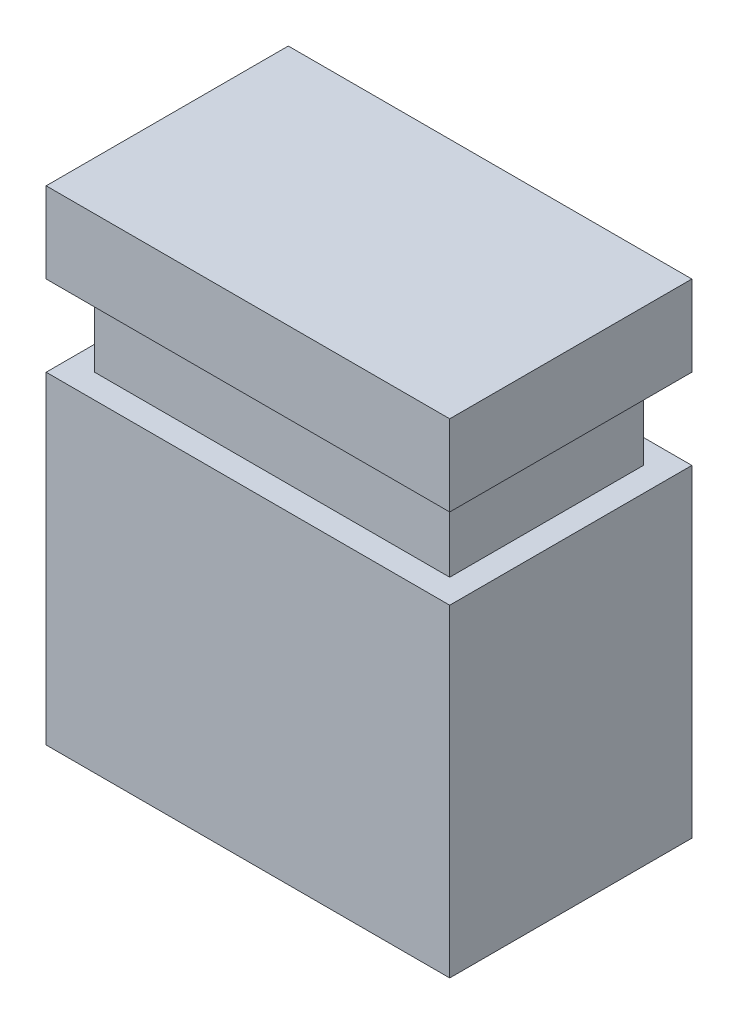
ISO-10303-21;
HEADER;
FILE_DESCRIPTION(('STEP AP214'),'2;1');
FILE_NAME('part.step','',(''),(''),'','','');
FILE_SCHEMA(('AUTOMOTIVE_DESIGN { 1 0 10303 214 1 1 1 1 }'));
ENDSEC;
DATA;
#1=APPLICATION_CONTEXT('core data for automotive mechanical design processes');
#2=APPLICATION_PROTOCOL_DEFINITION('international standard','automotive_design',2000,#1);
#3=PRODUCT_CONTEXT('',#1,'mechanical');
#4=PRODUCT('Part','Part','',(#3));
#5=PRODUCT_RELATED_PRODUCT_CATEGORY('part','',(#4));
#6=PRODUCT_DEFINITION_FORMATION('','',#4);
#7=PRODUCT_DEFINITION_CONTEXT('part definition',#1,'design');
#8=PRODUCT_DEFINITION('design','',#6,#7);
#9=PRODUCT_DEFINITION_SHAPE('','',#8);
#10=(LENGTH_UNIT() NAMED_UNIT(*) SI_UNIT(.MILLI.,.METRE.));
#11=(NAMED_UNIT(*) PLANE_ANGLE_UNIT() SI_UNIT($,.RADIAN.));
#12=(NAMED_UNIT(*) SI_UNIT($,.STERADIAN.) SOLID_ANGLE_UNIT());
#13=UNCERTAINTY_MEASURE_WITH_UNIT(LENGTH_MEASURE(1.E-05),#10,'distance_accuracy_value','');
#14=(GEOMETRIC_REPRESENTATION_CONTEXT(3) GLOBAL_UNCERTAINTY_ASSIGNED_CONTEXT((#13)) GLOBAL_UNIT_ASSIGNED_CONTEXT((#10,
#11,#12)) REPRESENTATION_CONTEXT('',''));
#15=CARTESIAN_POINT('',(0.,0.,0.));
#16=DIRECTION('',(0.,0.,1.));
#17=DIRECTION('',(1.,0.,0.));
#18=AXIS2_PLACEMENT_3D('',#15,#16,#17);
#19=CARTESIAN_POINT('',(0.,2.,0.));
#20=DIRECTION('',(0.,1.,0.));
#21=DIRECTION('',(0.,0.,1.));
#22=AXIS2_PLACEMENT_3D('',#19,#20,#21);
#23=PLANE('',#22);
#24=DIRECTION('',(0.,0.,-1.));
#25=VECTOR('',#24,1.);
#26=CARTESIAN_POINT('',(1.25,2.,-0.75));
#27=LINE('',#26,#25);
#28=CARTESIAN_POINT('',(1.25,2.,0.75));
#29=VERTEX_POINT('',#28);
#30=CARTESIAN_POINT('',(1.25,2.,-0.75));
#31=VERTEX_POINT('',#30);
#32=EDGE_CURVE('E362',#29,#31,#27,.T.);
#33=ORIENTED_EDGE('',*,*,#32,.T.);
#34=DIRECTION('',(-1.,0.,0.));
#35=VECTOR('',#34,1.);
#36=CARTESIAN_POINT('',(-1.25,2.,-0.75));
#37=LINE('',#36,#35);
#38=CARTESIAN_POINT('',(-1.25,2.,-0.75));
#39=VERTEX_POINT('',#38);
#40=EDGE_CURVE('E365',#31,#39,#37,.T.);
#41=ORIENTED_EDGE('',*,*,#40,.T.);
#42=DIRECTION('',(0.,0.,1.));
#43=VECTOR('',#42,1.);
#44=CARTESIAN_POINT('',(-1.25,2.,-0.75));
#45=LINE('',#44,#43);
#46=CARTESIAN_POINT('',(-1.25,2.,0.75));
#47=VERTEX_POINT('',#46);
#48=EDGE_CURVE('E368',#39,#47,#45,.T.);
#49=ORIENTED_EDGE('',*,*,#48,.T.);
#50=DIRECTION('',(1.,0.,0.));
#51=VECTOR('',#50,1.);
#52=CARTESIAN_POINT('',(-1.25,2.,0.75));
#53=LINE('',#52,#51);
#54=EDGE_CURVE('E370',#47,#29,#53,.T.);
#55=ORIENTED_EDGE('',*,*,#54,.T.);
#56=EDGE_LOOP('',(#33,#41,#49,#55));
#57=FACE_BOUND('',#56,.T.);
#58=DIRECTION('',(1.,0.,0.));
#59=VECTOR('',#58,1.);
#60=CARTESIAN_POINT('',(1.1,2.,0.6));
#61=LINE('',#60,#59);
#62=CARTESIAN_POINT('',(-1.1,2.,0.6));
#63=VERTEX_POINT('',#62);
#64=CARTESIAN_POINT('',(1.1,2.,0.6));
#65=VERTEX_POINT('',#64);
#66=EDGE_CURVE('E346',#63,#65,#61,.T.);
#67=ORIENTED_EDGE('',*,*,#66,.F.);
#68=DIRECTION('',(0.,0.,1.));
#69=VECTOR('',#68,1.);
#70=CARTESIAN_POINT('',(-1.1,2.,-0.6));
#71=LINE('',#70,#69);
#72=CARTESIAN_POINT('',(-1.1,2.,-0.6));
#73=VERTEX_POINT('',#72);
#74=EDGE_CURVE('E329',#73,#63,#71,.T.);
#75=ORIENTED_EDGE('',*,*,#74,.F.);
#76=DIRECTION('',(-1.,0.,0.));
#77=VECTOR('',#76,1.);
#78=CARTESIAN_POINT('',(1.1,2.,-0.6));
#79=LINE('',#78,#77);
#80=CARTESIAN_POINT('',(1.1,2.,-0.6));
#81=VERTEX_POINT('',#80);
#82=EDGE_CURVE('E334',#81,#73,#79,.T.);
#83=ORIENTED_EDGE('',*,*,#82,.F.);
#84=DIRECTION('',(0.,0.,-1.));
#85=VECTOR('',#84,1.);
#86=CARTESIAN_POINT('',(1.1,2.,-0.6));
#87=LINE('',#86,#85);
#88=EDGE_CURVE('E348',#65,#81,#87,.T.);
#89=ORIENTED_EDGE('',*,*,#88,.F.);
#90=EDGE_LOOP('',(#67,#75,#83,#89));
#91=FACE_BOUND('',#90,.T.);
#92=ADVANCED_FACE('F37',(#57,#91),#23,.T.);
#93=CARTESIAN_POINT('',(1.25,2.,-0.75));
#94=DIRECTION('',(-1.,0.,0.));
#95=DIRECTION('',(0.,0.,1.));
#96=AXIS2_PLACEMENT_3D('',#93,#94,#95);
#97=PLANE('',#96);
#98=DIRECTION('',(0.,0.,-1.));
#99=VECTOR('',#98,1.);
#100=CARTESIAN_POINT('',(1.25,0.,-0.75));
#101=LINE('',#100,#99);
#102=CARTESIAN_POINT('',(1.25,0.,0.75));
#103=VERTEX_POINT('',#102);
#104=CARTESIAN_POINT('',(1.25,0.,-0.75));
#105=VERTEX_POINT('',#104);
#106=EDGE_CURVE('E361',#103,#105,#101,.T.);
#107=ORIENTED_EDGE('',*,*,#106,.T.);
#108=DIRECTION('',(0.,-1.,0.));
#109=VECTOR('',#108,1.);
#110=CARTESIAN_POINT('',(1.25,2.,-0.75));
#111=LINE('',#110,#109);
#112=EDGE_CURVE('E12',#31,#105,#111,.T.);
#113=ORIENTED_EDGE('',*,*,#112,.F.);
#114=ORIENTED_EDGE('',*,*,#32,.F.);
#115=DIRECTION('',(0.,-1.,0.));
#116=VECTOR('',#115,1.);
#117=CARTESIAN_POINT('',(1.25,2.,0.75));
#118=LINE('',#117,#116);
#119=EDGE_CURVE('E372',#29,#103,#118,.T.);
#120=ORIENTED_EDGE('',*,*,#119,.T.);
#121=EDGE_LOOP('',(#107,#113,#114,#120));
#122=FACE_BOUND('',#121,.T.);
#123=ADVANCED_FACE('F39',(#122),#97,.F.);
#124=CARTESIAN_POINT('',(-1.25,2.,-0.75));
#125=DIRECTION('',(0.,0.,1.));
#126=DIRECTION('',(1.,0.,0.));
#127=AXIS2_PLACEMENT_3D('',#124,#125,#126);
#128=PLANE('',#127);
#129=DIRECTION('',(-1.,0.,0.));
#130=VECTOR('',#129,1.);
#131=CARTESIAN_POINT('',(-1.25,0.,-0.75));
#132=LINE('',#131,#130);
#133=CARTESIAN_POINT('',(-1.25,0.,-0.75));
#134=VERTEX_POINT('',#133);
#135=EDGE_CURVE('E375',#105,#134,#132,.T.);
#136=ORIENTED_EDGE('',*,*,#135,.T.);
#137=DIRECTION('',(0.,-1.,0.));
#138=VECTOR('',#137,1.);
#139=CARTESIAN_POINT('',(-1.25,2.,-0.75));
#140=LINE('',#139,#138);
#141=EDGE_CURVE('E45',#39,#134,#140,.T.);
#142=ORIENTED_EDGE('',*,*,#141,.F.);
#143=ORIENTED_EDGE('',*,*,#40,.F.);
#144=ORIENTED_EDGE('',*,*,#112,.T.);
#145=EDGE_LOOP('',(#136,#142,#143,#144));
#146=FACE_BOUND('',#145,.T.);
#147=ADVANCED_FACE('F405',(#146),#128,.F.);
#148=CARTESIAN_POINT('',(-1.25,2.,-0.75));
#149=DIRECTION('',(1.,0.,0.));
#150=DIRECTION('',(0.,0.,-1.));
#151=AXIS2_PLACEMENT_3D('',#148,#149,#150);
#152=PLANE('',#151);
#153=DIRECTION('',(0.,0.,1.));
#154=VECTOR('',#153,1.);
#155=CARTESIAN_POINT('',(-1.25,0.,-0.75));
#156=LINE('',#155,#154);
#157=CARTESIAN_POINT('',(-1.25,0.,0.75));
#158=VERTEX_POINT('',#157);
#159=EDGE_CURVE('E377',#134,#158,#156,.T.);
#160=ORIENTED_EDGE('',*,*,#159,.T.);
#161=DIRECTION('',(0.,-1.,0.));
#162=VECTOR('',#161,1.);
#163=CARTESIAN_POINT('',(-1.25,2.,0.75));
#164=LINE('',#163,#162);
#165=EDGE_CURVE('E382',#47,#158,#164,.T.);
#166=ORIENTED_EDGE('',*,*,#165,.F.);
#167=ORIENTED_EDGE('',*,*,#48,.F.);
#168=ORIENTED_EDGE('',*,*,#141,.T.);
#169=EDGE_LOOP('',(#160,#166,#167,#168));
#170=FACE_BOUND('',#169,.T.);
#171=ADVANCED_FACE('F389',(#170),#152,.F.);
#172=CARTESIAN_POINT('',(-1.25,2.,0.75));
#173=DIRECTION('',(0.,0.,-1.));
#174=DIRECTION('',(-1.,0.,0.));
#175=AXIS2_PLACEMENT_3D('',#172,#173,#174);
#176=PLANE('',#175);
#177=DIRECTION('',(1.,0.,0.));
#178=VECTOR('',#177,1.);
#179=CARTESIAN_POINT('',(-1.25,0.,0.75));
#180=LINE('',#179,#178);
#181=EDGE_CURVE('E366',#158,#103,#180,.T.);
#182=ORIENTED_EDGE('',*,*,#181,.T.);
#183=ORIENTED_EDGE('',*,*,#119,.F.);
#184=ORIENTED_EDGE('',*,*,#54,.F.);
#185=ORIENTED_EDGE('',*,*,#165,.T.);
#186=EDGE_LOOP('',(#182,#183,#184,#185));
#187=FACE_BOUND('',#186,.T.);
#188=ADVANCED_FACE('F398',(#187),#176,.F.);
#189=CARTESIAN_POINT('',(0.,0.,0.));
#190=DIRECTION('',(0.,1.,0.));
#191=DIRECTION('',(0.,0.,1.));
#192=AXIS2_PLACEMENT_3D('',#189,#190,#191);
#193=PLANE('',#192);
#194=DIRECTION('',(1.,0.,0.));
#195=VECTOR('',#194,1.);
#196=CARTESIAN_POINT('',(1.,0.,-0.5));
#197=LINE('',#196,#195);
#198=CARTESIAN_POINT('',(-1.,0.,-0.5));
#199=VERTEX_POINT('',#198);
#200=CARTESIAN_POINT('',(1.,0.,-0.5));
#201=VERTEX_POINT('',#200);
#202=EDGE_CURVE('E283',#199,#201,#197,.T.);
#203=ORIENTED_EDGE('',*,*,#202,.F.);
#204=DIRECTION('',(0.,0.,-1.));
#205=VECTOR('',#204,1.);
#206=CARTESIAN_POINT('',(-1.,0.,0.5));
#207=LINE('',#206,#205);
#208=CARTESIAN_POINT('',(-1.,0.,0.5));
#209=VERTEX_POINT('',#208);
#210=EDGE_CURVE('E267',#209,#199,#207,.T.);
#211=ORIENTED_EDGE('',*,*,#210,.F.);
#212=DIRECTION('',(-1.,0.,0.));
#213=VECTOR('',#212,1.);
#214=CARTESIAN_POINT('',(1.,0.,0.5));
#215=LINE('',#214,#213);
#216=CARTESIAN_POINT('',(1.,0.,0.5));
#217=VERTEX_POINT('',#216);
#218=EDGE_CURVE('E272',#217,#209,#215,.T.);
#219=ORIENTED_EDGE('',*,*,#218,.F.);
#220=DIRECTION('',(0.,0.,1.));
#221=VECTOR('',#220,1.);
#222=CARTESIAN_POINT('',(1.,0.,0.5));
#223=LINE('',#222,#221);
#224=EDGE_CURVE('E286',#201,#217,#223,.T.);
#225=ORIENTED_EDGE('',*,*,#224,.F.);
#226=EDGE_LOOP('',(#203,#211,#219,#225));
#227=FACE_BOUND('',#226,.T.);
#228=ORIENTED_EDGE('',*,*,#106,.F.);
#229=ORIENTED_EDGE('',*,*,#181,.F.);
#230=ORIENTED_EDGE('',*,*,#159,.F.);
#231=ORIENTED_EDGE('',*,*,#135,.F.);
#232=EDGE_LOOP('',(#228,#229,#230,#231));
#233=FACE_BOUND('',#232,.T.);
#234=ADVANCED_FACE('F395',(#227,#233),#193,.F.);
#235=CARTESIAN_POINT('',(-1.1,2.5,-0.6));
#236=DIRECTION('',(1.,0.,0.));
#237=DIRECTION('',(0.,0.,-1.));
#238=AXIS2_PLACEMENT_3D('',#235,#236,#237);
#239=PLANE('',#238);
#240=ORIENTED_EDGE('',*,*,#74,.T.);
#241=DIRECTION('',(0.,-1.,0.));
#242=VECTOR('',#241,1.);
#243=CARTESIAN_POINT('',(-1.1,2.5,0.6));
#244=LINE('',#243,#242);
#245=CARTESIAN_POINT('',(-1.1,2.5,0.6));
#246=VERTEX_POINT('',#245);
#247=EDGE_CURVE('E359',#246,#63,#244,.T.);
#248=ORIENTED_EDGE('',*,*,#247,.F.);
#249=DIRECTION('',(0.,0.,1.));
#250=VECTOR('',#249,1.);
#251=CARTESIAN_POINT('',(-1.1,2.5,-0.6));
#252=LINE('',#251,#250);
#253=CARTESIAN_POINT('',(-1.1,2.5,-0.6));
#254=VERTEX_POINT('',#253);
#255=EDGE_CURVE('E330',#254,#246,#252,.T.);
#256=ORIENTED_EDGE('',*,*,#255,.F.);
#257=DIRECTION('',(0.,-1.,0.));
#258=VECTOR('',#257,1.);
#259=CARTESIAN_POINT('',(-1.1,2.5,-0.6));
#260=LINE('',#259,#258);
#261=EDGE_CURVE('E343',#254,#73,#260,.T.);
#262=ORIENTED_EDGE('',*,*,#261,.T.);
#263=EDGE_LOOP('',(#240,#248,#256,#262));
#264=FACE_BOUND('',#263,.T.);
#265=ADVANCED_FACE('F418',(#264),#239,.F.);
#266=CARTESIAN_POINT('',(1.1,2.5,0.6));
#267=DIRECTION('',(0.,0.,-1.));
#268=DIRECTION('',(-1.,0.,0.));
#269=AXIS2_PLACEMENT_3D('',#266,#267,#268);
#270=PLANE('',#269);
#271=ORIENTED_EDGE('',*,*,#66,.T.);
#272=DIRECTION('',(0.,-1.,0.));
#273=VECTOR('',#272,1.);
#274=CARTESIAN_POINT('',(1.1,2.5,0.6));
#275=LINE('',#274,#273);
#276=CARTESIAN_POINT('',(1.1,2.5,0.6));
#277=VERTEX_POINT('',#276);
#278=EDGE_CURVE('E356',#277,#65,#275,.T.);
#279=ORIENTED_EDGE('',*,*,#278,.F.);
#280=DIRECTION('',(1.,0.,0.));
#281=VECTOR('',#280,1.);
#282=CARTESIAN_POINT('',(1.1,2.5,0.6));
#283=LINE('',#282,#281);
#284=EDGE_CURVE('E333',#246,#277,#283,.T.);
#285=ORIENTED_EDGE('',*,*,#284,.F.);
#286=ORIENTED_EDGE('',*,*,#247,.T.);
#287=EDGE_LOOP('',(#271,#279,#285,#286));
#288=FACE_BOUND('',#287,.T.);
#289=ADVANCED_FACE('F440',(#288),#270,.F.);
#290=CARTESIAN_POINT('',(1.1,2.5,-0.6));
#291=DIRECTION('',(-1.,0.,0.));
#292=DIRECTION('',(0.,0.,1.));
#293=AXIS2_PLACEMENT_3D('',#290,#291,#292);
#294=PLANE('',#293);
#295=ORIENTED_EDGE('',*,*,#88,.T.);
#296=DIRECTION('',(0.,-1.,0.));
#297=VECTOR('',#296,1.);
#298=CARTESIAN_POINT('',(1.1,2.5,-0.6));
#299=LINE('',#298,#297);
#300=CARTESIAN_POINT('',(1.1,2.5,-0.6));
#301=VERTEX_POINT('',#300);
#302=EDGE_CURVE('E354',#301,#81,#299,.T.);
#303=ORIENTED_EDGE('',*,*,#302,.F.);
#304=DIRECTION('',(0.,0.,-1.));
#305=VECTOR('',#304,1.);
#306=CARTESIAN_POINT('',(1.1,2.5,-0.6));
#307=LINE('',#306,#305);
#308=EDGE_CURVE('E337',#277,#301,#307,.T.);
#309=ORIENTED_EDGE('',*,*,#308,.F.);
#310=ORIENTED_EDGE('',*,*,#278,.T.);
#311=EDGE_LOOP('',(#295,#303,#309,#310));
#312=FACE_BOUND('',#311,.T.);
#313=ADVANCED_FACE('F447',(#312),#294,.F.);
#314=CARTESIAN_POINT('',(1.1,2.5,-0.6));
#315=DIRECTION('',(0.,0.,1.));
#316=DIRECTION('',(1.,0.,0.));
#317=AXIS2_PLACEMENT_3D('',#314,#315,#316);
#318=PLANE('',#317);
#319=ORIENTED_EDGE('',*,*,#82,.T.);
#320=ORIENTED_EDGE('',*,*,#261,.F.);
#321=DIRECTION('',(-1.,0.,0.));
#322=VECTOR('',#321,1.);
#323=CARTESIAN_POINT('',(1.1,2.5,-0.6));
#324=LINE('',#323,#322);
#325=EDGE_CURVE('E340',#301,#254,#324,.T.);
#326=ORIENTED_EDGE('',*,*,#325,.F.);
#327=ORIENTED_EDGE('',*,*,#302,.T.);
#328=EDGE_LOOP('',(#319,#320,#326,#327));
#329=FACE_BOUND('',#328,.T.);
#330=ADVANCED_FACE('F454',(#329),#318,.F.);
#331=CARTESIAN_POINT('',(0.,2.5,0.));
#332=DIRECTION('',(0.,1.,0.));
#333=DIRECTION('',(0.,0.,1.));
#334=AXIS2_PLACEMENT_3D('',#331,#332,#333);
#335=PLANE('',#334);
#336=DIRECTION('',(0.,0.,1.));
#337=VECTOR('',#336,1.);
#338=CARTESIAN_POINT('',(-1.25,2.5,-0.75));
#339=LINE('',#338,#337);
#340=CARTESIAN_POINT('',(-1.25,2.5,-0.75));
#341=VERTEX_POINT('',#340);
#342=CARTESIAN_POINT('',(-1.25,2.5,0.75));
#343=VERTEX_POINT('',#342);
#344=EDGE_CURVE('E293',#341,#343,#339,.T.);
#345=ORIENTED_EDGE('',*,*,#344,.F.);
#346=DIRECTION('',(-1.,0.,0.));
#347=VECTOR('',#346,1.);
#348=CARTESIAN_POINT('',(-1.25,2.5,-0.75));
#349=LINE('',#348,#347);
#350=CARTESIAN_POINT('',(1.25,2.5,-0.75));
#351=VERTEX_POINT('',#350);
#352=EDGE_CURVE('E304',#351,#341,#349,.T.);
#353=ORIENTED_EDGE('',*,*,#352,.F.);
#354=DIRECTION('',(0.,0.,-1.));
#355=VECTOR('',#354,1.);
#356=CARTESIAN_POINT('',(1.25,2.5,-0.75));
#357=LINE('',#356,#355);
#358=CARTESIAN_POINT('',(1.25,2.5,0.75));
#359=VERTEX_POINT('',#358);
#360=EDGE_CURVE('E315',#359,#351,#357,.T.);
#361=ORIENTED_EDGE('',*,*,#360,.F.);
#362=DIRECTION('',(1.,0.,0.));
#363=VECTOR('',#362,1.);
#364=CARTESIAN_POINT('',(-1.25,2.5,0.75));
#365=LINE('',#364,#363);
#366=EDGE_CURVE('E313',#343,#359,#365,.T.);
#367=ORIENTED_EDGE('',*,*,#366,.F.);
#368=EDGE_LOOP('',(#345,#353,#361,#367));
#369=FACE_BOUND('',#368,.T.);
#370=ORIENTED_EDGE('',*,*,#325,.T.);
#371=ORIENTED_EDGE('',*,*,#255,.T.);
#372=ORIENTED_EDGE('',*,*,#284,.T.);
#373=ORIENTED_EDGE('',*,*,#308,.T.);
#374=EDGE_LOOP('',(#370,#371,#372,#373));
#375=FACE_BOUND('',#374,.T.);
#376=ADVANCED_FACE('F462',(#369,#375),#335,.F.);
#377=CARTESIAN_POINT('',(-1.25,3.,-0.75));
#378=DIRECTION('',(1.,0.,0.));
#379=DIRECTION('',(0.,0.,-1.));
#380=AXIS2_PLACEMENT_3D('',#377,#378,#379);
#381=PLANE('',#380);
#382=ORIENTED_EDGE('',*,*,#344,.T.);
#383=DIRECTION('',(0.,-1.,0.));
#384=VECTOR('',#383,1.);
#385=CARTESIAN_POINT('',(-1.25,3.,0.75));
#386=LINE('',#385,#384);
#387=CARTESIAN_POINT('',(-1.25,3.,0.75));
#388=VERTEX_POINT('',#387);
#389=EDGE_CURVE('E326',#388,#343,#386,.T.);
#390=ORIENTED_EDGE('',*,*,#389,.F.);
#391=DIRECTION('',(0.,0.,1.));
#392=VECTOR('',#391,1.);
#393=CARTESIAN_POINT('',(-1.25,3.,-0.75));
#394=LINE('',#393,#392);
#395=CARTESIAN_POINT('',(-1.25,3.,-0.75));
#396=VERTEX_POINT('',#395);
#397=EDGE_CURVE('E300',#396,#388,#394,.T.);
#398=ORIENTED_EDGE('',*,*,#397,.F.);
#399=DIRECTION('',(0.,-1.,0.));
#400=VECTOR('',#399,1.);
#401=CARTESIAN_POINT('',(-1.25,3.,-0.75));
#402=LINE('',#401,#400);
#403=EDGE_CURVE('E310',#396,#341,#402,.T.);
#404=ORIENTED_EDGE('',*,*,#403,.T.);
#405=EDGE_LOOP('',(#382,#390,#398,#404));
#406=FACE_BOUND('',#405,.T.);
#407=ADVANCED_FACE('F470',(#406),#381,.F.);
#408=CARTESIAN_POINT('',(-1.25,3.,0.75));
#409=DIRECTION('',(0.,0.,-1.));
#410=DIRECTION('',(-1.,0.,0.));
#411=AXIS2_PLACEMENT_3D('',#408,#409,#410);
#412=PLANE('',#411);
#413=ORIENTED_EDGE('',*,*,#366,.T.);
#414=DIRECTION('',(0.,-1.,0.));
#415=VECTOR('',#414,1.);
#416=CARTESIAN_POINT('',(1.25,3.,0.75));
#417=LINE('',#416,#415);
#418=CARTESIAN_POINT('',(1.25,3.,0.75));
#419=VERTEX_POINT('',#418);
#420=EDGE_CURVE('E323',#419,#359,#417,.T.);
#421=ORIENTED_EDGE('',*,*,#420,.F.);
#422=DIRECTION('',(1.,0.,0.));
#423=VECTOR('',#422,1.);
#424=CARTESIAN_POINT('',(-1.25,3.,0.75));
#425=LINE('',#424,#423);
#426=EDGE_CURVE('E303',#388,#419,#425,.T.);
#427=ORIENTED_EDGE('',*,*,#426,.F.);
#428=ORIENTED_EDGE('',*,*,#389,.T.);
#429=EDGE_LOOP('',(#413,#421,#427,#428));
#430=FACE_BOUND('',#429,.T.);
#431=ADVANCED_FACE('F478',(#430),#412,.F.);
#432=CARTESIAN_POINT('',(1.25,3.,-0.75));
#433=DIRECTION('',(-1.,0.,0.));
#434=DIRECTION('',(0.,0.,1.));
#435=AXIS2_PLACEMENT_3D('',#432,#433,#434);
#436=PLANE('',#435);
#437=ORIENTED_EDGE('',*,*,#360,.T.);
#438=DIRECTION('',(0.,-1.,0.));
#439=VECTOR('',#438,1.);
#440=CARTESIAN_POINT('',(1.25,3.,-0.75));
#441=LINE('',#440,#439);
#442=CARTESIAN_POINT('',(1.25,3.,-0.75));
#443=VERTEX_POINT('',#442);
#444=EDGE_CURVE('E320',#443,#351,#441,.T.);
#445=ORIENTED_EDGE('',*,*,#444,.F.);
#446=DIRECTION('',(0.,0.,-1.));
#447=VECTOR('',#446,1.);
#448=CARTESIAN_POINT('',(1.25,3.,-0.75));
#449=LINE('',#448,#447);
#450=EDGE_CURVE('E306',#419,#443,#449,.T.);
#451=ORIENTED_EDGE('',*,*,#450,.F.);
#452=ORIENTED_EDGE('',*,*,#420,.T.);
#453=EDGE_LOOP('',(#437,#445,#451,#452));
#454=FACE_BOUND('',#453,.T.);
#455=ADVANCED_FACE('F486',(#454),#436,.F.);
#456=CARTESIAN_POINT('',(-1.25,3.,-0.75));
#457=DIRECTION('',(0.,0.,1.));
#458=DIRECTION('',(1.,0.,0.));
#459=AXIS2_PLACEMENT_3D('',#456,#457,#458);
#460=PLANE('',#459);
#461=ORIENTED_EDGE('',*,*,#352,.T.);
#462=ORIENTED_EDGE('',*,*,#403,.F.);
#463=DIRECTION('',(-1.,0.,0.));
#464=VECTOR('',#463,1.);
#465=CARTESIAN_POINT('',(-1.25,3.,-0.75));
#466=LINE('',#465,#464);
#467=EDGE_CURVE('E308',#443,#396,#466,.T.);
#468=ORIENTED_EDGE('',*,*,#467,.F.);
#469=ORIENTED_EDGE('',*,*,#444,.T.);
#470=EDGE_LOOP('',(#461,#462,#468,#469));
#471=FACE_BOUND('',#470,.T.);
#472=ADVANCED_FACE('F494',(#471),#460,.F.);
#473=CARTESIAN_POINT('',(0.,3.,0.));
#474=DIRECTION('',(0.,1.,0.));
#475=DIRECTION('',(0.,0.,1.));
#476=AXIS2_PLACEMENT_3D('',#473,#474,#475);
#477=PLANE('',#476);
#478=ORIENTED_EDGE('',*,*,#397,.T.);
#479=ORIENTED_EDGE('',*,*,#426,.T.);
#480=ORIENTED_EDGE('',*,*,#450,.T.);
#481=ORIENTED_EDGE('',*,*,#467,.T.);
#482=EDGE_LOOP('',(#478,#479,#480,#481));
#483=FACE_BOUND('',#482,.T.);
#484=ADVANCED_FACE('F502',(#483),#477,.T.);
#485=CARTESIAN_POINT('',(-1.,0.2,0.5));
#486=DIRECTION('',(-1.,0.,0.));
#487=DIRECTION('',(0.,0.,1.));
#488=AXIS2_PLACEMENT_3D('',#485,#486,#487);
#489=PLANE('',#488);
#490=ORIENTED_EDGE('',*,*,#210,.T.);
#491=DIRECTION('',(0.,-1.,0.));
#492=VECTOR('',#491,1.);
#493=CARTESIAN_POINT('',(-1.,0.2,-0.5));
#494=LINE('',#493,#492);
#495=CARTESIAN_POINT('',(-1.,0.2,-0.5));
#496=VERTEX_POINT('',#495);
#497=EDGE_CURVE('E281',#496,#199,#494,.T.);
#498=ORIENTED_EDGE('',*,*,#497,.F.);
#499=DIRECTION('',(0.,0.,-1.));
#500=VECTOR('',#499,1.);
#501=CARTESIAN_POINT('',(-1.,0.2,0.5));
#502=LINE('',#501,#500);
#503=CARTESIAN_POINT('',(-1.,0.2,0.5));
#504=VERTEX_POINT('',#503);
#505=EDGE_CURVE('E268',#504,#496,#502,.T.);
#506=ORIENTED_EDGE('',*,*,#505,.F.);
#507=DIRECTION('',(0.,-1.,0.));
#508=VECTOR('',#507,1.);
#509=CARTESIAN_POINT('',(-1.,0.2,0.5));
#510=LINE('',#509,#508);
#511=EDGE_CURVE('E291',#504,#209,#510,.T.);
#512=ORIENTED_EDGE('',*,*,#511,.T.);
#513=EDGE_LOOP('',(#490,#498,#506,#512));
#514=FACE_BOUND('',#513,.T.);
#515=ADVANCED_FACE('F509',(#514),#489,.F.);
#516=CARTESIAN_POINT('',(1.,0.2,0.5));
#517=DIRECTION('',(0.,0.,1.));
#518=DIRECTION('',(1.,0.,0.));
#519=AXIS2_PLACEMENT_3D('',#516,#517,#518);
#520=PLANE('',#519);
#521=ORIENTED_EDGE('',*,*,#218,.T.);
#522=ORIENTED_EDGE('',*,*,#511,.F.);
#523=DIRECTION('',(-1.,0.,0.));
#524=VECTOR('',#523,1.);
#525=CARTESIAN_POINT('',(1.,0.2,0.5));
#526=LINE('',#525,#524);
#527=CARTESIAN_POINT('',(1.,0.2,0.5));
#528=VERTEX_POINT('',#527);
#529=EDGE_CURVE('E278',#528,#504,#526,.T.);
#530=ORIENTED_EDGE('',*,*,#529,.F.);
#531=DIRECTION('',(0.,-1.,0.));
#532=VECTOR('',#531,1.);
#533=CARTESIAN_POINT('',(1.,0.2,0.5));
#534=LINE('',#533,#532);
#535=EDGE_CURVE('E294',#528,#217,#534,.T.);
#536=ORIENTED_EDGE('',*,*,#535,.T.);
#537=EDGE_LOOP('',(#521,#522,#530,#536));
#538=FACE_BOUND('',#537,.T.);
#539=ADVANCED_FACE('F516',(#538),#520,.F.);
#540=CARTESIAN_POINT('',(1.,0.2,0.5));
#541=DIRECTION('',(1.,0.,0.));
#542=DIRECTION('',(0.,0.,-1.));
#543=AXIS2_PLACEMENT_3D('',#540,#541,#542);
#544=PLANE('',#543);
#545=ORIENTED_EDGE('',*,*,#224,.T.);
#546=ORIENTED_EDGE('',*,*,#535,.F.);
#547=DIRECTION('',(0.,0.,1.));
#548=VECTOR('',#547,1.);
#549=CARTESIAN_POINT('',(1.,0.2,0.5));
#550=LINE('',#549,#548);
#551=CARTESIAN_POINT('',(1.,0.2,-0.5));
#552=VERTEX_POINT('',#551);
#553=EDGE_CURVE('E275',#552,#528,#550,.T.);
#554=ORIENTED_EDGE('',*,*,#553,.F.);
#555=DIRECTION('',(0.,-1.,0.));
#556=VECTOR('',#555,1.);
#557=CARTESIAN_POINT('',(1.,0.2,-0.5));
#558=LINE('',#557,#556);
#559=EDGE_CURVE('E296',#552,#201,#558,.T.);
#560=ORIENTED_EDGE('',*,*,#559,.T.);
#561=EDGE_LOOP('',(#545,#546,#554,#560));
#562=FACE_BOUND('',#561,.T.);
#563=ADVANCED_FACE('F524',(#562),#544,.F.);
#564=CARTESIAN_POINT('',(1.,0.2,-0.5));
#565=DIRECTION('',(0.,0.,-1.));
#566=DIRECTION('',(-1.,0.,0.));
#567=AXIS2_PLACEMENT_3D('',#564,#565,#566);
#568=PLANE('',#567);
#569=ORIENTED_EDGE('',*,*,#202,.T.);
#570=ORIENTED_EDGE('',*,*,#559,.F.);
#571=DIRECTION('',(1.,0.,0.));
#572=VECTOR('',#571,1.);
#573=CARTESIAN_POINT('',(1.,0.2,-0.5));
#574=LINE('',#573,#572);
#575=EDGE_CURVE('E271',#496,#552,#574,.T.);
#576=ORIENTED_EDGE('',*,*,#575,.F.);
#577=ORIENTED_EDGE('',*,*,#497,.T.);
#578=EDGE_LOOP('',(#569,#570,#576,#577));
#579=FACE_BOUND('',#578,.T.);
#580=ADVANCED_FACE('F532',(#579),#568,.F.);
#581=CARTESIAN_POINT('',(0.,0.2,0.));
#582=DIRECTION('',(0.,1.,0.));
#583=DIRECTION('',(0.,0.,1.));
#584=AXIS2_PLACEMENT_3D('',#581,#582,#583);
#585=PLANE('',#584);
#586=DIRECTION('',(1.,0.,0.));
#587=VECTOR('',#586,1.);
#588=CARTESIAN_POINT('',(0.885,0.2,-0.25));
#589=LINE('',#588,#587);
#590=CARTESIAN_POINT('',(0.385,0.2,-0.25));
#591=VERTEX_POINT('',#590);
#592=CARTESIAN_POINT('',(0.885,0.2,-0.25));
#593=VERTEX_POINT('',#592);
#594=EDGE_CURVE('E223',#591,#593,#589,.T.);
#595=ORIENTED_EDGE('',*,*,#594,.F.);
#596=DIRECTION('',(0.,0.,-1.));
#597=VECTOR('',#596,1.);
#598=CARTESIAN_POINT('',(0.385,0.2,0.25));
#599=LINE('',#598,#597);
#600=CARTESIAN_POINT('',(0.385,0.2,0.25));
#601=VERTEX_POINT('',#600);
#602=EDGE_CURVE('E216',#601,#591,#599,.T.);
#603=ORIENTED_EDGE('',*,*,#602,.F.);
#604=DIRECTION('',(-1.,0.,0.));
#605=VECTOR('',#604,1.);
#606=CARTESIAN_POINT('',(0.885,0.2,0.25));
#607=LINE('',#606,#605);
#608=CARTESIAN_POINT('',(0.885,0.2,0.25));
#609=VERTEX_POINT('',#608);
#610=EDGE_CURVE('E227',#609,#601,#607,.T.);
#611=ORIENTED_EDGE('',*,*,#610,.F.);
#612=DIRECTION('',(0.,0.,1.));
#613=VECTOR('',#612,1.);
#614=CARTESIAN_POINT('',(0.885,0.2,0.25));
#615=LINE('',#614,#613);
#616=EDGE_CURVE('E52',#593,#609,#615,.T.);
#617=ORIENTED_EDGE('',*,*,#616,.F.);
#618=EDGE_LOOP('',(#595,#603,#611,#617));
#619=FACE_BOUND('',#618,.T.);
#620=DIRECTION('',(0.,0.,-1.));
#621=VECTOR('',#620,1.);
#622=CARTESIAN_POINT('',(-0.885,0.2,0.25));
#623=LINE('',#622,#621);
#624=CARTESIAN_POINT('',(-0.885,0.2,0.25));
#625=VERTEX_POINT('',#624);
#626=CARTESIAN_POINT('',(-0.885,0.2,-0.25));
#627=VERTEX_POINT('',#626);
#628=EDGE_CURVE('E240',#625,#627,#623,.T.);
#629=ORIENTED_EDGE('',*,*,#628,.F.);
#630=DIRECTION('',(-1.,0.,0.));
#631=VECTOR('',#630,1.);
#632=CARTESIAN_POINT('',(-0.885,0.2,0.25));
#633=LINE('',#632,#631);
#634=CARTESIAN_POINT('',(-0.385,0.2,0.25));
#635=VERTEX_POINT('',#634);
#636=EDGE_CURVE('E243',#635,#625,#633,.T.);
#637=ORIENTED_EDGE('',*,*,#636,.F.);
#638=DIRECTION('',(0.,0.,1.));
#639=VECTOR('',#638,1.);
#640=CARTESIAN_POINT('',(-0.385,0.2,0.25));
#641=LINE('',#640,#639);
#642=CARTESIAN_POINT('',(-0.385,0.2,-0.25));
#643=VERTEX_POINT('',#642);
#644=EDGE_CURVE('E237',#643,#635,#641,.T.);
#645=ORIENTED_EDGE('',*,*,#644,.F.);
#646=DIRECTION('',(1.,0.,0.));
#647=VECTOR('',#646,1.);
#648=CARTESIAN_POINT('',(-0.885,0.2,-0.25));
#649=LINE('',#648,#647);
#650=EDGE_CURVE('E60',#627,#643,#649,.T.);
#651=ORIENTED_EDGE('',*,*,#650,.F.);
#652=EDGE_LOOP('',(#629,#637,#645,#651));
#653=FACE_BOUND('',#652,.T.);
#654=ORIENTED_EDGE('',*,*,#505,.T.);
#655=ORIENTED_EDGE('',*,*,#575,.T.);
#656=ORIENTED_EDGE('',*,*,#553,.T.);
#657=ORIENTED_EDGE('',*,*,#529,.T.);
#658=EDGE_LOOP('',(#654,#655,#656,#657));
#659=FACE_BOUND('',#658,.T.);
#660=ADVANCED_FACE('F540',(#619,#653,#659),#585,.F.);
#661=CARTESIAN_POINT('',(0.,2.5,0.));
#662=DIRECTION('',(0.,1.,0.));
#663=DIRECTION('',(0.,0.,1.));
#664=AXIS2_PLACEMENT_3D('',#661,#662,#663);
#665=PLANE('',#664);
#666=DIRECTION('',(0.,0.,1.));
#667=VECTOR('',#666,1.);
#668=CARTESIAN_POINT('',(-0.385,2.5,0.25));
#669=LINE('',#668,#667);
#670=CARTESIAN_POINT('',(-0.385,2.5,-0.25));
#671=VERTEX_POINT('',#670);
#672=CARTESIAN_POINT('',(-0.385,2.5,0.25));
#673=VERTEX_POINT('',#672);
#674=EDGE_CURVE('E251',#671,#673,#669,.T.);
#675=ORIENTED_EDGE('',*,*,#674,.T.);
#676=DIRECTION('',(-1.,0.,0.));
#677=VECTOR('',#676,1.);
#678=CARTESIAN_POINT('',(-0.885,2.5,0.25));
#679=LINE('',#678,#677);
#680=CARTESIAN_POINT('',(-0.885,2.5,0.25));
#681=VERTEX_POINT('',#680);
#682=EDGE_CURVE('E239',#673,#681,#679,.T.);
#683=ORIENTED_EDGE('',*,*,#682,.T.);
#684=DIRECTION('',(0.,0.,-1.));
#685=VECTOR('',#684,1.);
#686=CARTESIAN_POINT('',(-0.885,2.5,0.25));
#687=LINE('',#686,#685);
#688=CARTESIAN_POINT('',(-0.885,2.5,-0.25));
#689=VERTEX_POINT('',#688);
#690=EDGE_CURVE('E260',#681,#689,#687,.T.);
#691=ORIENTED_EDGE('',*,*,#690,.T.);
#692=DIRECTION('',(1.,0.,0.));
#693=VECTOR('',#692,1.);
#694=CARTESIAN_POINT('',(-0.885,2.5,-0.25));
#695=LINE('',#694,#693);
#696=EDGE_CURVE('E256',#689,#671,#695,.T.);
#697=ORIENTED_EDGE('',*,*,#696,.T.);
#698=EDGE_LOOP('',(#675,#683,#691,#697));
#699=FACE_BOUND('',#698,.T.);
#700=ADVANCED_FACE('F549',(#699),#665,.F.);
#701=CARTESIAN_POINT('',(-0.885,3.70710678118655,0.25));
#702=DIRECTION('',(0.,0.,1.));
#703=DIRECTION('',(1.,0.,0.));
#704=AXIS2_PLACEMENT_3D('',#701,#702,#703);
#705=PLANE('',#704);
#706=DIRECTION('',(0.,-1.,0.));
#707=VECTOR('',#706,1.);
#708=CARTESIAN_POINT('',(-0.385,3.70710678118655,0.25));
#709=LINE('',#708,#707);
#710=EDGE_CURVE('E254',#673,#635,#709,.T.);
#711=ORIENTED_EDGE('',*,*,#710,.T.);
#712=ORIENTED_EDGE('',*,*,#636,.T.);
#713=DIRECTION('',(0.,-1.,0.));
#714=VECTOR('',#713,1.);
#715=CARTESIAN_POINT('',(-0.885,3.70710678118655,0.25));
#716=LINE('',#715,#714);
#717=EDGE_CURVE('E250',#681,#625,#716,.T.);
#718=ORIENTED_EDGE('',*,*,#717,.F.);
#719=ORIENTED_EDGE('',*,*,#682,.F.);
#720=EDGE_LOOP('',(#711,#712,#718,#719));
#721=FACE_BOUND('',#720,.T.);
#722=ADVANCED_FACE('F556',(#721),#705,.F.);
#723=CARTESIAN_POINT('',(-0.885,3.70710678118655,0.25));
#724=DIRECTION('',(-1.,0.,0.));
#725=DIRECTION('',(0.,0.,1.));
#726=AXIS2_PLACEMENT_3D('',#723,#724,#725);
#727=PLANE('',#726);
#728=ORIENTED_EDGE('',*,*,#717,.T.);
#729=ORIENTED_EDGE('',*,*,#628,.T.);
#730=DIRECTION('',(0.,-1.,0.));
#731=VECTOR('',#730,1.);
#732=CARTESIAN_POINT('',(-0.885,3.70710678118655,-0.25));
#733=LINE('',#732,#731);
#734=EDGE_CURVE('E259',#689,#627,#733,.T.);
#735=ORIENTED_EDGE('',*,*,#734,.F.);
#736=ORIENTED_EDGE('',*,*,#690,.F.);
#737=EDGE_LOOP('',(#728,#729,#735,#736));
#738=FACE_BOUND('',#737,.T.);
#739=ADVANCED_FACE('F564',(#738),#727,.F.);
#740=CARTESIAN_POINT('',(-0.885,3.70710678118655,-0.25));
#741=DIRECTION('',(0.,0.,-1.));
#742=DIRECTION('',(-1.,0.,0.));
#743=AXIS2_PLACEMENT_3D('',#740,#741,#742);
#744=PLANE('',#743);
#745=ORIENTED_EDGE('',*,*,#734,.T.);
#746=ORIENTED_EDGE('',*,*,#650,.T.);
#747=DIRECTION('',(0.,-1.,0.));
#748=VECTOR('',#747,1.);
#749=CARTESIAN_POINT('',(-0.385,3.70710678118655,-0.25));
#750=LINE('',#749,#748);
#751=EDGE_CURVE('E255',#671,#643,#750,.T.);
#752=ORIENTED_EDGE('',*,*,#751,.F.);
#753=ORIENTED_EDGE('',*,*,#696,.F.);
#754=EDGE_LOOP('',(#745,#746,#752,#753));
#755=FACE_BOUND('',#754,.T.);
#756=ADVANCED_FACE('F572',(#755),#744,.F.);
#757=CARTESIAN_POINT('',(-0.385,3.70710678118655,0.25));
#758=DIRECTION('',(1.,0.,0.));
#759=DIRECTION('',(0.,0.,-1.));
#760=AXIS2_PLACEMENT_3D('',#757,#758,#759);
#761=PLANE('',#760);
#762=ORIENTED_EDGE('',*,*,#751,.T.);
#763=ORIENTED_EDGE('',*,*,#644,.T.);
#764=ORIENTED_EDGE('',*,*,#710,.F.);
#765=ORIENTED_EDGE('',*,*,#674,.F.);
#766=EDGE_LOOP('',(#762,#763,#764,#765));
#767=FACE_BOUND('',#766,.T.);
#768=ADVANCED_FACE('F580',(#767),#761,.F.);
#769=CARTESIAN_POINT('',(0.,2.5,0.));
#770=DIRECTION('',(0.,1.,0.));
#771=DIRECTION('',(0.,0.,1.));
#772=AXIS2_PLACEMENT_3D('',#769,#770,#771);
#773=PLANE('',#772);
#774=DIRECTION('',(-1.,0.,0.));
#775=VECTOR('',#774,1.);
#776=CARTESIAN_POINT('',(0.885,2.5,0.25));
#777=LINE('',#776,#775);
#778=CARTESIAN_POINT('',(0.885,2.5,0.25));
#779=VERTEX_POINT('',#778);
#780=CARTESIAN_POINT('',(0.385,2.5,0.25));
#781=VERTEX_POINT('',#780);
#782=EDGE_CURVE('E220',#779,#781,#777,.T.);
#783=ORIENTED_EDGE('',*,*,#782,.T.);
#784=DIRECTION('',(0.,0.,-1.));
#785=VECTOR('',#784,1.);
#786=CARTESIAN_POINT('',(0.385,2.5,0.25));
#787=LINE('',#786,#785);
#788=CARTESIAN_POINT('',(0.385,2.5,-0.25));
#789=VERTEX_POINT('',#788);
#790=EDGE_CURVE('E213',#781,#789,#787,.T.);
#791=ORIENTED_EDGE('',*,*,#790,.T.);
#792=DIRECTION('',(1.,0.,0.));
#793=VECTOR('',#792,1.);
#794=CARTESIAN_POINT('',(0.885,2.5,-0.25));
#795=LINE('',#794,#793);
#796=CARTESIAN_POINT('',(0.885,2.5,-0.25));
#797=VERTEX_POINT('',#796);
#798=EDGE_CURVE('E200',#789,#797,#795,.T.);
#799=ORIENTED_EDGE('',*,*,#798,.T.);
#800=DIRECTION('',(0.,0.,1.));
#801=VECTOR('',#800,1.);
#802=CARTESIAN_POINT('',(0.885,2.5,0.25));
#803=LINE('',#802,#801);
#804=EDGE_CURVE('E232',#797,#779,#803,.T.);
#805=ORIENTED_EDGE('',*,*,#804,.T.);
#806=EDGE_LOOP('',(#783,#791,#799,#805));
#807=FACE_BOUND('',#806,.T.);
#808=ADVANCED_FACE('F219',(#807),#773,.F.);
#809=CARTESIAN_POINT('',(0.385,3.70710678118655,0.25));
#810=DIRECTION('',(-1.,0.,0.));
#811=DIRECTION('',(0.,0.,1.));
#812=AXIS2_PLACEMENT_3D('',#809,#810,#811);
#813=PLANE('',#812);
#814=DIRECTION('',(0.,-1.,0.));
#815=VECTOR('',#814,1.);
#816=CARTESIAN_POINT('',(0.385,3.70710678118655,0.25));
#817=LINE('',#816,#815);
#818=EDGE_CURVE('E230',#781,#601,#817,.T.);
#819=ORIENTED_EDGE('',*,*,#818,.T.);
#820=ORIENTED_EDGE('',*,*,#602,.T.);
#821=DIRECTION('',(0.,-1.,0.));
#822=VECTOR('',#821,1.);
#823=CARTESIAN_POINT('',(0.385,3.70710678118655,-0.25));
#824=LINE('',#823,#822);
#825=EDGE_CURVE('E204',#789,#591,#824,.T.);
#826=ORIENTED_EDGE('',*,*,#825,.F.);
#827=ORIENTED_EDGE('',*,*,#790,.F.);
#828=EDGE_LOOP('',(#819,#820,#826,#827));
#829=FACE_BOUND('',#828,.T.);
#830=ADVANCED_FACE('F212',(#829),#813,.F.);
#831=CARTESIAN_POINT('',(0.885,3.70710678118655,-0.25));
#832=DIRECTION('',(0.,0.,-1.));
#833=DIRECTION('',(-1.,0.,0.));
#834=AXIS2_PLACEMENT_3D('',#831,#832,#833);
#835=PLANE('',#834);
#836=ORIENTED_EDGE('',*,*,#825,.T.);
#837=ORIENTED_EDGE('',*,*,#594,.T.);
#838=DIRECTION('',(0.,-1.,0.));
#839=VECTOR('',#838,1.);
#840=CARTESIAN_POINT('',(0.885,3.70710678118655,-0.25));
#841=LINE('',#840,#839);
#842=EDGE_CURVE('E206',#797,#593,#841,.T.);
#843=ORIENTED_EDGE('',*,*,#842,.F.);
#844=ORIENTED_EDGE('',*,*,#798,.F.);
#845=EDGE_LOOP('',(#836,#837,#843,#844));
#846=FACE_BOUND('',#845,.T.);
#847=ADVANCED_FACE('F202',(#846),#835,.F.);
#848=CARTESIAN_POINT('',(0.885,3.70710678118655,0.25));
#849=DIRECTION('',(1.,0.,0.));
#850=DIRECTION('',(0.,0.,-1.));
#851=AXIS2_PLACEMENT_3D('',#848,#849,#850);
#852=PLANE('',#851);
#853=ORIENTED_EDGE('',*,*,#842,.T.);
#854=ORIENTED_EDGE('',*,*,#616,.T.);
#855=DIRECTION('',(0.,-1.,0.));
#856=VECTOR('',#855,1.);
#857=CARTESIAN_POINT('',(0.885,3.70710678118655,0.25));
#858=LINE('',#857,#856);
#859=EDGE_CURVE('E231',#779,#609,#858,.T.);
#860=ORIENTED_EDGE('',*,*,#859,.F.);
#861=ORIENTED_EDGE('',*,*,#804,.F.);
#862=EDGE_LOOP('',(#853,#854,#860,#861));
#863=FACE_BOUND('',#862,.T.);
#864=ADVANCED_FACE('F606',(#863),#852,.F.);
#865=CARTESIAN_POINT('',(0.885,3.70710678118655,0.25));
#866=DIRECTION('',(0.,0.,1.));
#867=DIRECTION('',(1.,0.,0.));
#868=AXIS2_PLACEMENT_3D('',#865,#866,#867);
#869=PLANE('',#868);
#870=ORIENTED_EDGE('',*,*,#859,.T.);
#871=ORIENTED_EDGE('',*,*,#610,.T.);
#872=ORIENTED_EDGE('',*,*,#818,.F.);
#873=ORIENTED_EDGE('',*,*,#782,.F.);
#874=EDGE_LOOP('',(#870,#871,#872,#873));
#875=FACE_BOUND('',#874,.T.);
#876=ADVANCED_FACE('F613',(#875),#869,.F.);
#877=CLOSED_SHELL('',(#92,#123,#147,#171,#188,#234,#265,#289,#313,#330,#376,#407,#431,#455,#472,
#484,#515,#539,#563,#580,#660,#700,#722,#739,#756,#768,#808,#830,#847,#864,#876));
#878=MANIFOLD_SOLID_BREP('B2',#877);
#879=ADVANCED_BREP_SHAPE_REPRESENTATION('',(#18,#878),#14);
#880=SHAPE_DEFINITION_REPRESENTATION(#9,#879);
ENDSEC;
END-ISO-10303-21;
